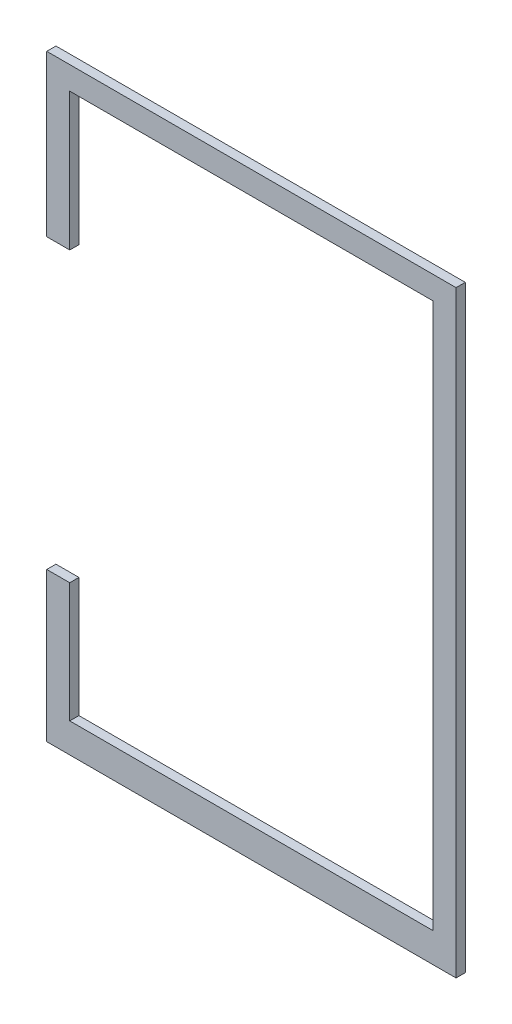
ISO-10303-21;
HEADER;
FILE_DESCRIPTION(('STEP AP214'),'2;1');
FILE_NAME('part.step','',(''),(''),'','','');
FILE_SCHEMA(('AUTOMOTIVE_DESIGN { 1 0 10303 214 1 1 1 1 }'));
ENDSEC;
DATA;
#1=APPLICATION_CONTEXT('core data for automotive mechanical design processes');
#2=APPLICATION_PROTOCOL_DEFINITION('international standard','automotive_design',2000,#1);
#3=PRODUCT_CONTEXT('',#1,'mechanical');
#4=PRODUCT('Part','Part','',(#3));
#5=PRODUCT_RELATED_PRODUCT_CATEGORY('part','',(#4));
#6=PRODUCT_DEFINITION_FORMATION('','',#4);
#7=PRODUCT_DEFINITION_CONTEXT('part definition',#1,'design');
#8=PRODUCT_DEFINITION('design','',#6,#7);
#9=PRODUCT_DEFINITION_SHAPE('','',#8);
#10=(LENGTH_UNIT() NAMED_UNIT(*) SI_UNIT(.MILLI.,.METRE.));
#11=(NAMED_UNIT(*) PLANE_ANGLE_UNIT() SI_UNIT($,.RADIAN.));
#12=(NAMED_UNIT(*) SI_UNIT($,.STERADIAN.) SOLID_ANGLE_UNIT());
#13=UNCERTAINTY_MEASURE_WITH_UNIT(LENGTH_MEASURE(1.E-05),#10,'distance_accuracy_value','');
#14=(GEOMETRIC_REPRESENTATION_CONTEXT(3) GLOBAL_UNCERTAINTY_ASSIGNED_CONTEXT((#13)) GLOBAL_UNIT_ASSIGNED_CONTEXT((#10,
#11,#12)) REPRESENTATION_CONTEXT('',''));
#15=CARTESIAN_POINT('',(0.,0.,0.));
#16=DIRECTION('',(0.,0.,1.));
#17=DIRECTION('',(1.,0.,0.));
#18=AXIS2_PLACEMENT_3D('',#15,#16,#17);
#19=CARTESIAN_POINT('',(-97.1224879400284,125.255410605211,-4.));
#20=DIRECTION('',(0.,1.,0.));
#21=DIRECTION('',(-1.,0.,0.));
#22=AXIS2_PLACEMENT_3D('',#19,#20,#21);
#23=PLANE('',#22);
#24=DIRECTION('',(-1.,0.,0.));
#25=VECTOR('',#24,1.);
#26=CARTESIAN_POINT('',(-97.1224879400284,125.255410605211,0.));
#27=LINE('',#26,#25);
#28=CARTESIAN_POINT('',(80.8775120599717,125.255410605211,0.));
#29=VERTEX_POINT('',#28);
#30=CARTESIAN_POINT('',(-97.1224879400284,125.255410605211,0.));
#31=VERTEX_POINT('',#30);
#32=EDGE_CURVE('E160',#29,#31,#27,.T.);
#33=ORIENTED_EDGE('',*,*,#32,.F.);
#34=DIRECTION('',(0.,0.,1.));
#35=VECTOR('',#34,1.);
#36=CARTESIAN_POINT('',(80.8775120599717,125.255410605211,-4.));
#37=LINE('',#36,#35);
#38=CARTESIAN_POINT('',(80.8775120599717,125.255410605211,-4.));
#39=VERTEX_POINT('',#38);
#40=EDGE_CURVE('E11',#39,#29,#37,.T.);
#41=ORIENTED_EDGE('',*,*,#40,.F.);
#42=DIRECTION('',(-1.,0.,0.));
#43=VECTOR('',#42,1.);
#44=CARTESIAN_POINT('',(-97.1224879400284,125.255410605211,-4.));
#45=LINE('',#44,#43);
#46=CARTESIAN_POINT('',(-97.1224879400284,125.255410605211,-4.));
#47=VERTEX_POINT('',#46);
#48=EDGE_CURVE('E192',#39,#47,#45,.T.);
#49=ORIENTED_EDGE('',*,*,#48,.T.);
#50=DIRECTION('',(0.,0.,1.));
#51=VECTOR('',#50,1.);
#52=CARTESIAN_POINT('',(-97.1224879400284,125.255410605211,-4.));
#53=LINE('',#52,#51);
#54=EDGE_CURVE('E42',#47,#31,#53,.T.);
#55=ORIENTED_EDGE('',*,*,#54,.T.);
#56=EDGE_LOOP('',(#33,#41,#49,#55));
#57=FACE_BOUND('',#56,.T.);
#58=ADVANCED_FACE('F39',(#57),#23,.T.);
#59=CARTESIAN_POINT('',(80.8775120599717,125.255410605211,-4.));
#60=DIRECTION('',(1.,0.,0.));
#61=DIRECTION('',(0.,1.,0.));
#62=AXIS2_PLACEMENT_3D('',#59,#60,#61);
#63=PLANE('',#62);
#64=DIRECTION('',(0.,1.,0.));
#65=VECTOR('',#64,1.);
#66=CARTESIAN_POINT('',(80.8775120599717,125.255410605211,0.));
#67=LINE('',#66,#65);
#68=CARTESIAN_POINT('',(80.8775120599717,-134.744589394789,0.));
#69=VERTEX_POINT('',#68);
#70=EDGE_CURVE('E190',#69,#29,#67,.T.);
#71=ORIENTED_EDGE('',*,*,#70,.F.);
#72=DIRECTION('',(0.,0.,1.));
#73=VECTOR('',#72,1.);
#74=CARTESIAN_POINT('',(80.8775120599717,-134.744589394789,-4.));
#75=LINE('',#74,#73);
#76=CARTESIAN_POINT('',(80.8775120599717,-134.744589394789,-4.));
#77=VERTEX_POINT('',#76);
#78=EDGE_CURVE('E48',#77,#69,#75,.T.);
#79=ORIENTED_EDGE('',*,*,#78,.F.);
#80=DIRECTION('',(0.,1.,0.));
#81=VECTOR('',#80,1.);
#82=CARTESIAN_POINT('',(80.8775120599717,125.255410605211,-4.));
#83=LINE('',#82,#81);
#84=EDGE_CURVE('E150',#77,#39,#83,.T.);
#85=ORIENTED_EDGE('',*,*,#84,.T.);
#86=ORIENTED_EDGE('',*,*,#40,.T.);
#87=EDGE_LOOP('',(#71,#79,#85,#86));
#88=FACE_BOUND('',#87,.T.);
#89=ADVANCED_FACE('F212',(#88),#63,.T.);
#90=CARTESIAN_POINT('',(-97.1224879400283,-134.744589394789,-4.));
#91=DIRECTION('',(0.,-1.,0.));
#92=DIRECTION('',(0.,0.,-1.));
#93=AXIS2_PLACEMENT_3D('',#90,#91,#92);
#94=PLANE('',#93);
#95=DIRECTION('',(1.,0.,0.));
#96=VECTOR('',#95,1.);
#97=CARTESIAN_POINT('',(-97.1224879400283,-134.744589394789,0.));
#98=LINE('',#97,#96);
#99=CARTESIAN_POINT('',(-97.1224879400283,-134.744589394789,0.));
#100=VERTEX_POINT('',#99);
#101=EDGE_CURVE('E137',#100,#69,#98,.T.);
#102=ORIENTED_EDGE('',*,*,#101,.F.);
#103=DIRECTION('',(0.,0.,1.));
#104=VECTOR('',#103,1.);
#105=CARTESIAN_POINT('',(-97.1224879400283,-134.744589394789,-4.));
#106=LINE('',#105,#104);
#107=CARTESIAN_POINT('',(-97.1224879400283,-134.744589394789,-4.));
#108=VERTEX_POINT('',#107);
#109=EDGE_CURVE('E132',#108,#100,#106,.T.);
#110=ORIENTED_EDGE('',*,*,#109,.F.);
#111=DIRECTION('',(1.,0.,0.));
#112=VECTOR('',#111,1.);
#113=CARTESIAN_POINT('',(-97.1224879400283,-134.744589394789,-4.));
#114=LINE('',#113,#112);
#115=EDGE_CURVE('E135',#108,#77,#114,.T.);
#116=ORIENTED_EDGE('',*,*,#115,.T.);
#117=ORIENTED_EDGE('',*,*,#78,.T.);
#118=EDGE_LOOP('',(#102,#110,#116,#117));
#119=FACE_BOUND('',#118,.T.);
#120=ADVANCED_FACE('F134',(#119),#94,.T.);
#121=CARTESIAN_POINT('',(-97.1224879400283,-69.8770461627428,-4.));
#122=DIRECTION('',(-1.,0.,0.));
#123=DIRECTION('',(0.,-1.,0.));
#124=AXIS2_PLACEMENT_3D('',#121,#122,#123);
#125=PLANE('',#124);
#126=DIRECTION('',(0.,-1.,0.));
#127=VECTOR('',#126,1.);
#128=CARTESIAN_POINT('',(-97.1224879400283,-69.8770461627428,0.));
#129=LINE('',#128,#127);
#130=CARTESIAN_POINT('',(-97.1224879400283,-69.8770461627428,0.));
#131=VERTEX_POINT('',#130);
#132=EDGE_CURVE('E187',#131,#100,#129,.T.);
#133=ORIENTED_EDGE('',*,*,#132,.F.);
#134=DIRECTION('',(0.,0.,1.));
#135=VECTOR('',#134,1.);
#136=CARTESIAN_POINT('',(-97.1224879400283,-69.8770461627428,-4.));
#137=LINE('',#136,#135);
#138=CARTESIAN_POINT('',(-97.1224879400283,-69.8770461627428,-4.));
#139=VERTEX_POINT('',#138);
#140=EDGE_CURVE('E142',#139,#131,#137,.T.);
#141=ORIENTED_EDGE('',*,*,#140,.F.);
#142=DIRECTION('',(0.,-1.,0.));
#143=VECTOR('',#142,1.);
#144=CARTESIAN_POINT('',(-97.1224879400283,-69.8770461627428,-4.));
#145=LINE('',#144,#143);
#146=EDGE_CURVE('E148',#139,#108,#145,.T.);
#147=ORIENTED_EDGE('',*,*,#146,.T.);
#148=ORIENTED_EDGE('',*,*,#109,.T.);
#149=EDGE_LOOP('',(#133,#141,#147,#148));
#150=FACE_BOUND('',#149,.T.);
#151=ADVANCED_FACE('F152',(#150),#125,.T.);
#152=CARTESIAN_POINT('',(-97.1224879400283,-69.8770461627428,-4.));
#153=DIRECTION('',(0.,1.,0.));
#154=DIRECTION('',(0.,0.,1.));
#155=AXIS2_PLACEMENT_3D('',#152,#153,#154);
#156=PLANE('',#155);
#157=DIRECTION('',(-1.,0.,0.));
#158=VECTOR('',#157,1.);
#159=CARTESIAN_POINT('',(-97.1224879400283,-69.8770461627428,0.));
#160=LINE('',#159,#158);
#161=CARTESIAN_POINT('',(-87.1224879400279,-69.8770461627428,0.));
#162=VERTEX_POINT('',#161);
#163=EDGE_CURVE('E184',#162,#131,#160,.T.);
#164=ORIENTED_EDGE('',*,*,#163,.F.);
#165=DIRECTION('',(0.,0.,1.));
#166=VECTOR('',#165,1.);
#167=CARTESIAN_POINT('',(-87.1224879400279,-69.8770461627428,-4.));
#168=LINE('',#167,#166);
#169=CARTESIAN_POINT('',(-87.1224879400279,-69.8770461627428,-4.));
#170=VERTEX_POINT('',#169);
#171=EDGE_CURVE('E196',#170,#162,#168,.T.);
#172=ORIENTED_EDGE('',*,*,#171,.F.);
#173=DIRECTION('',(-1.,0.,0.));
#174=VECTOR('',#173,1.);
#175=CARTESIAN_POINT('',(-97.1224879400283,-69.8770461627428,-4.));
#176=LINE('',#175,#174);
#177=EDGE_CURVE('E153',#170,#139,#176,.T.);
#178=ORIENTED_EDGE('',*,*,#177,.T.);
#179=ORIENTED_EDGE('',*,*,#140,.T.);
#180=EDGE_LOOP('',(#164,#172,#178,#179));
#181=FACE_BOUND('',#180,.T.);
#182=ADVANCED_FACE('F225',(#181),#156,.T.);
#183=CARTESIAN_POINT('',(-87.1224879400279,-69.8770461627428,-4.));
#184=DIRECTION('',(1.,0.,0.));
#185=DIRECTION('',(0.,0.,-1.));
#186=AXIS2_PLACEMENT_3D('',#183,#184,#185);
#187=PLANE('',#186);
#188=DIRECTION('',(0.,1.,0.));
#189=VECTOR('',#188,1.);
#190=CARTESIAN_POINT('',(-87.1224879400279,-69.8770461627428,0.));
#191=LINE('',#190,#189);
#192=CARTESIAN_POINT('',(-87.1224879400279,-121.912372196922,0.));
#193=VERTEX_POINT('',#192);
#194=EDGE_CURVE('E181',#193,#162,#191,.T.);
#195=ORIENTED_EDGE('',*,*,#194,.F.);
#196=DIRECTION('',(0.,0.,1.));
#197=VECTOR('',#196,1.);
#198=CARTESIAN_POINT('',(-87.1224879400279,-121.912372196922,-4.));
#199=LINE('',#198,#197);
#200=CARTESIAN_POINT('',(-87.1224879400279,-121.912372196922,-4.));
#201=VERTEX_POINT('',#200);
#202=EDGE_CURVE('E198',#201,#193,#199,.T.);
#203=ORIENTED_EDGE('',*,*,#202,.F.);
#204=DIRECTION('',(0.,1.,0.));
#205=VECTOR('',#204,1.);
#206=CARTESIAN_POINT('',(-87.1224879400279,-69.8770461627428,-4.));
#207=LINE('',#206,#205);
#208=EDGE_CURVE('E155',#201,#170,#207,.T.);
#209=ORIENTED_EDGE('',*,*,#208,.T.);
#210=ORIENTED_EDGE('',*,*,#171,.T.);
#211=EDGE_LOOP('',(#195,#203,#209,#210));
#212=FACE_BOUND('',#211,.T.);
#213=ADVANCED_FACE('F228',(#212),#187,.T.);
#214=CARTESIAN_POINT('',(-87.1224879400279,-121.912372196922,-4.));
#215=DIRECTION('',(0.,1.,0.));
#216=DIRECTION('',(-1.,0.,0.));
#217=AXIS2_PLACEMENT_3D('',#214,#215,#216);
#218=PLANE('',#217);
#219=DIRECTION('',(-1.,0.,0.));
#220=VECTOR('',#219,1.);
#221=CARTESIAN_POINT('',(-87.1224879400279,-121.912372196922,0.));
#222=LINE('',#221,#220);
#223=CARTESIAN_POINT('',(70.8775120599721,-121.912372196922,0.));
#224=VERTEX_POINT('',#223);
#225=EDGE_CURVE('E178',#224,#193,#222,.T.);
#226=ORIENTED_EDGE('',*,*,#225,.F.);
#227=DIRECTION('',(0.,0.,1.));
#228=VECTOR('',#227,1.);
#229=CARTESIAN_POINT('',(70.8775120599721,-121.912372196922,-4.));
#230=LINE('',#229,#228);
#231=CARTESIAN_POINT('',(70.8775120599721,-121.912372196922,-4.));
#232=VERTEX_POINT('',#231);
#233=EDGE_CURVE('E200',#232,#224,#230,.T.);
#234=ORIENTED_EDGE('',*,*,#233,.F.);
#235=DIRECTION('',(-1.,0.,0.));
#236=VECTOR('',#235,1.);
#237=CARTESIAN_POINT('',(-87.1224879400279,-121.912372196922,-4.));
#238=LINE('',#237,#236);
#239=EDGE_CURVE('E354',#232,#201,#238,.T.);
#240=ORIENTED_EDGE('',*,*,#239,.T.);
#241=ORIENTED_EDGE('',*,*,#202,.T.);
#242=EDGE_LOOP('',(#226,#234,#240,#241));
#243=FACE_BOUND('',#242,.T.);
#244=ADVANCED_FACE('F232',(#243),#218,.T.);
#245=CARTESIAN_POINT('',(70.8775120599721,115.255410605211,-4.));
#246=DIRECTION('',(-1.,0.,0.));
#247=DIRECTION('',(0.,0.,1.));
#248=AXIS2_PLACEMENT_3D('',#245,#246,#247);
#249=PLANE('',#248);
#250=DIRECTION('',(0.,-1.,0.));
#251=VECTOR('',#250,1.);
#252=CARTESIAN_POINT('',(70.8775120599721,115.255410605211,0.));
#253=LINE('',#252,#251);
#254=CARTESIAN_POINT('',(70.8775120599721,115.255410605211,0.));
#255=VERTEX_POINT('',#254);
#256=EDGE_CURVE('E175',#255,#224,#253,.T.);
#257=ORIENTED_EDGE('',*,*,#256,.F.);
#258=DIRECTION('',(0.,0.,1.));
#259=VECTOR('',#258,1.);
#260=CARTESIAN_POINT('',(70.8775120599721,115.255410605211,-4.));
#261=LINE('',#260,#259);
#262=CARTESIAN_POINT('',(70.8775120599721,115.255410605211,-4.));
#263=VERTEX_POINT('',#262);
#264=EDGE_CURVE('E202',#263,#255,#261,.T.);
#265=ORIENTED_EDGE('',*,*,#264,.F.);
#266=DIRECTION('',(0.,-1.,0.));
#267=VECTOR('',#266,1.);
#268=CARTESIAN_POINT('',(70.8775120599721,115.255410605211,-4.));
#269=LINE('',#268,#267);
#270=EDGE_CURVE('E358',#263,#232,#269,.T.);
#271=ORIENTED_EDGE('',*,*,#270,.T.);
#272=ORIENTED_EDGE('',*,*,#233,.T.);
#273=EDGE_LOOP('',(#257,#265,#271,#272));
#274=FACE_BOUND('',#273,.T.);
#275=ADVANCED_FACE('F236',(#274),#249,.T.);
#276=CARTESIAN_POINT('',(-87.1224879400279,115.255410605211,-4.));
#277=DIRECTION('',(0.,-1.,0.));
#278=DIRECTION('',(1.,0.,0.));
#279=AXIS2_PLACEMENT_3D('',#276,#277,#278);
#280=PLANE('',#279);
#281=DIRECTION('',(1.,0.,0.));
#282=VECTOR('',#281,1.);
#283=CARTESIAN_POINT('',(-87.1224879400279,115.255410605211,0.));
#284=LINE('',#283,#282);
#285=CARTESIAN_POINT('',(-87.1224879400279,115.255410605211,0.));
#286=VERTEX_POINT('',#285);
#287=EDGE_CURVE('E172',#286,#255,#284,.T.);
#288=ORIENTED_EDGE('',*,*,#287,.F.);
#289=DIRECTION('',(0.,0.,1.));
#290=VECTOR('',#289,1.);
#291=CARTESIAN_POINT('',(-87.1224879400279,115.255410605211,-4.));
#292=LINE('',#291,#290);
#293=CARTESIAN_POINT('',(-87.1224879400279,115.255410605211,-4.));
#294=VERTEX_POINT('',#293);
#295=EDGE_CURVE('E204',#294,#286,#292,.T.);
#296=ORIENTED_EDGE('',*,*,#295,.F.);
#297=DIRECTION('',(1.,0.,0.));
#298=VECTOR('',#297,1.);
#299=CARTESIAN_POINT('',(-87.1224879400279,115.255410605211,-4.));
#300=LINE('',#299,#298);
#301=EDGE_CURVE('E347',#294,#263,#300,.T.);
#302=ORIENTED_EDGE('',*,*,#301,.T.);
#303=ORIENTED_EDGE('',*,*,#264,.T.);
#304=EDGE_LOOP('',(#288,#296,#302,#303));
#305=FACE_BOUND('',#304,.T.);
#306=ADVANCED_FACE('F240',(#305),#280,.T.);
#307=CARTESIAN_POINT('',(-87.1224879400279,115.255410605211,-4.));
#308=DIRECTION('',(1.,0.,0.));
#309=DIRECTION('',(0.,0.,-1.));
#310=AXIS2_PLACEMENT_3D('',#307,#308,#309);
#311=PLANE('',#310);
#312=DIRECTION('',(0.,1.,0.));
#313=VECTOR('',#312,1.);
#314=CARTESIAN_POINT('',(-87.1224879400279,115.255410605211,0.));
#315=LINE('',#314,#313);
#316=CARTESIAN_POINT('',(-87.1224879400279,55.4224071356514,0.));
#317=VERTEX_POINT('',#316);
#318=EDGE_CURVE('E169',#317,#286,#315,.T.);
#319=ORIENTED_EDGE('',*,*,#318,.F.);
#320=DIRECTION('',(0.,0.,1.));
#321=VECTOR('',#320,1.);
#322=CARTESIAN_POINT('',(-87.1224879400279,55.4224071356514,-4.));
#323=LINE('',#322,#321);
#324=CARTESIAN_POINT('',(-87.1224879400279,55.4224071356514,-4.));
#325=VERTEX_POINT('',#324);
#326=EDGE_CURVE('E206',#325,#317,#323,.T.);
#327=ORIENTED_EDGE('',*,*,#326,.F.);
#328=DIRECTION('',(0.,1.,0.));
#329=VECTOR('',#328,1.);
#330=CARTESIAN_POINT('',(-87.1224879400279,115.255410605211,-4.));
#331=LINE('',#330,#329);
#332=EDGE_CURVE('E343',#325,#294,#331,.T.);
#333=ORIENTED_EDGE('',*,*,#332,.T.);
#334=ORIENTED_EDGE('',*,*,#295,.T.);
#335=EDGE_LOOP('',(#319,#327,#333,#334));
#336=FACE_BOUND('',#335,.T.);
#337=ADVANCED_FACE('F244',(#336),#311,.T.);
#338=CARTESIAN_POINT('',(-97.1224879400283,55.4224071356514,-4.));
#339=DIRECTION('',(0.,-1.,0.));
#340=DIRECTION('',(0.,0.,-1.));
#341=AXIS2_PLACEMENT_3D('',#338,#339,#340);
#342=PLANE('',#341);
#343=DIRECTION('',(1.,0.,0.));
#344=VECTOR('',#343,1.);
#345=CARTESIAN_POINT('',(-97.1224879400283,55.4224071356514,0.));
#346=LINE('',#345,#344);
#347=CARTESIAN_POINT('',(-97.1224879400283,55.4224071356514,0.));
#348=VERTEX_POINT('',#347);
#349=EDGE_CURVE('E166',#348,#317,#346,.T.);
#350=ORIENTED_EDGE('',*,*,#349,.F.);
#351=DIRECTION('',(0.,0.,1.));
#352=VECTOR('',#351,1.);
#353=CARTESIAN_POINT('',(-97.1224879400283,55.4224071356514,-4.));
#354=LINE('',#353,#352);
#355=CARTESIAN_POINT('',(-97.1224879400283,55.4224071356514,-4.));
#356=VERTEX_POINT('',#355);
#357=EDGE_CURVE('E207',#356,#348,#354,.T.);
#358=ORIENTED_EDGE('',*,*,#357,.F.);
#359=DIRECTION('',(1.,0.,0.));
#360=VECTOR('',#359,1.);
#361=CARTESIAN_POINT('',(-97.1224879400283,55.4224071356514,-4.));
#362=LINE('',#361,#360);
#363=EDGE_CURVE('E364',#356,#325,#362,.T.);
#364=ORIENTED_EDGE('',*,*,#363,.T.);
#365=ORIENTED_EDGE('',*,*,#326,.T.);
#366=EDGE_LOOP('',(#350,#358,#364,#365));
#367=FACE_BOUND('',#366,.T.);
#368=ADVANCED_FACE('F248',(#367),#342,.T.);
#369=CARTESIAN_POINT('',(-97.1224879400284,125.255410605211,-4.));
#370=DIRECTION('',(-1.,0.,0.));
#371=DIRECTION('',(0.,-1.,0.));
#372=AXIS2_PLACEMENT_3D('',#369,#370,#371);
#373=PLANE('',#372);
#374=DIRECTION('',(0.,-1.,0.));
#375=VECTOR('',#374,1.);
#376=CARTESIAN_POINT('',(-97.1224879400284,125.255410605211,0.));
#377=LINE('',#376,#375);
#378=EDGE_CURVE('E163',#31,#348,#377,.T.);
#379=ORIENTED_EDGE('',*,*,#378,.F.);
#380=ORIENTED_EDGE('',*,*,#54,.F.);
#381=DIRECTION('',(0.,-1.,0.));
#382=VECTOR('',#381,1.);
#383=CARTESIAN_POINT('',(-97.1224879400284,125.255410605211,-4.));
#384=LINE('',#383,#382);
#385=EDGE_CURVE('E366',#47,#356,#384,.T.);
#386=ORIENTED_EDGE('',*,*,#385,.T.);
#387=ORIENTED_EDGE('',*,*,#357,.T.);
#388=EDGE_LOOP('',(#379,#380,#386,#387));
#389=FACE_BOUND('',#388,.T.);
#390=ADVANCED_FACE('F209',(#389),#373,.T.);
#391=CARTESIAN_POINT('',(0.,0.,-4.));
#392=DIRECTION('',(0.,0.,-1.));
#393=DIRECTION('',(-1.,0.,0.));
#394=AXIS2_PLACEMENT_3D('',#391,#392,#393);
#395=PLANE('',#394);
#396=ORIENTED_EDGE('',*,*,#48,.F.);
#397=ORIENTED_EDGE('',*,*,#84,.F.);
#398=ORIENTED_EDGE('',*,*,#115,.F.);
#399=ORIENTED_EDGE('',*,*,#146,.F.);
#400=ORIENTED_EDGE('',*,*,#177,.F.);
#401=ORIENTED_EDGE('',*,*,#208,.F.);
#402=ORIENTED_EDGE('',*,*,#239,.F.);
#403=ORIENTED_EDGE('',*,*,#270,.F.);
#404=ORIENTED_EDGE('',*,*,#301,.F.);
#405=ORIENTED_EDGE('',*,*,#332,.F.);
#406=ORIENTED_EDGE('',*,*,#363,.F.);
#407=ORIENTED_EDGE('',*,*,#385,.F.);
#408=EDGE_LOOP('',(#396,#397,#398,#399,#400,#401,#402,#403,#404,#405,#406,#407));
#409=FACE_BOUND('',#408,.T.);
#410=ADVANCED_FACE('F146',(#409),#395,.T.);
#411=CARTESIAN_POINT('',(0.,0.,0.));
#412=DIRECTION('',(0.,0.,-1.));
#413=DIRECTION('',(-1.,0.,0.));
#414=AXIS2_PLACEMENT_3D('',#411,#412,#413);
#415=PLANE('',#414);
#416=ORIENTED_EDGE('',*,*,#32,.T.);
#417=ORIENTED_EDGE('',*,*,#378,.T.);
#418=ORIENTED_EDGE('',*,*,#349,.T.);
#419=ORIENTED_EDGE('',*,*,#318,.T.);
#420=ORIENTED_EDGE('',*,*,#287,.T.);
#421=ORIENTED_EDGE('',*,*,#256,.T.);
#422=ORIENTED_EDGE('',*,*,#225,.T.);
#423=ORIENTED_EDGE('',*,*,#194,.T.);
#424=ORIENTED_EDGE('',*,*,#163,.T.);
#425=ORIENTED_EDGE('',*,*,#132,.T.);
#426=ORIENTED_EDGE('',*,*,#101,.T.);
#427=ORIENTED_EDGE('',*,*,#70,.T.);
#428=EDGE_LOOP('',(#416,#417,#418,#419,#420,#421,#422,#423,#424,#425,#426,#427));
#429=FACE_BOUND('',#428,.T.);
#430=ADVANCED_FACE('F211',(#429),#415,.F.);
#431=CLOSED_SHELL('',(#58,#89,#120,#151,#182,#213,#244,#275,#306,#337,#368,#390,#410,#430));
#432=MANIFOLD_SOLID_BREP('B2',#431);
#433=ADVANCED_BREP_SHAPE_REPRESENTATION('',(#18,#432),#14);
#434=SHAPE_DEFINITION_REPRESENTATION(#9,#433);
ENDSEC;
END-ISO-10303-21;
